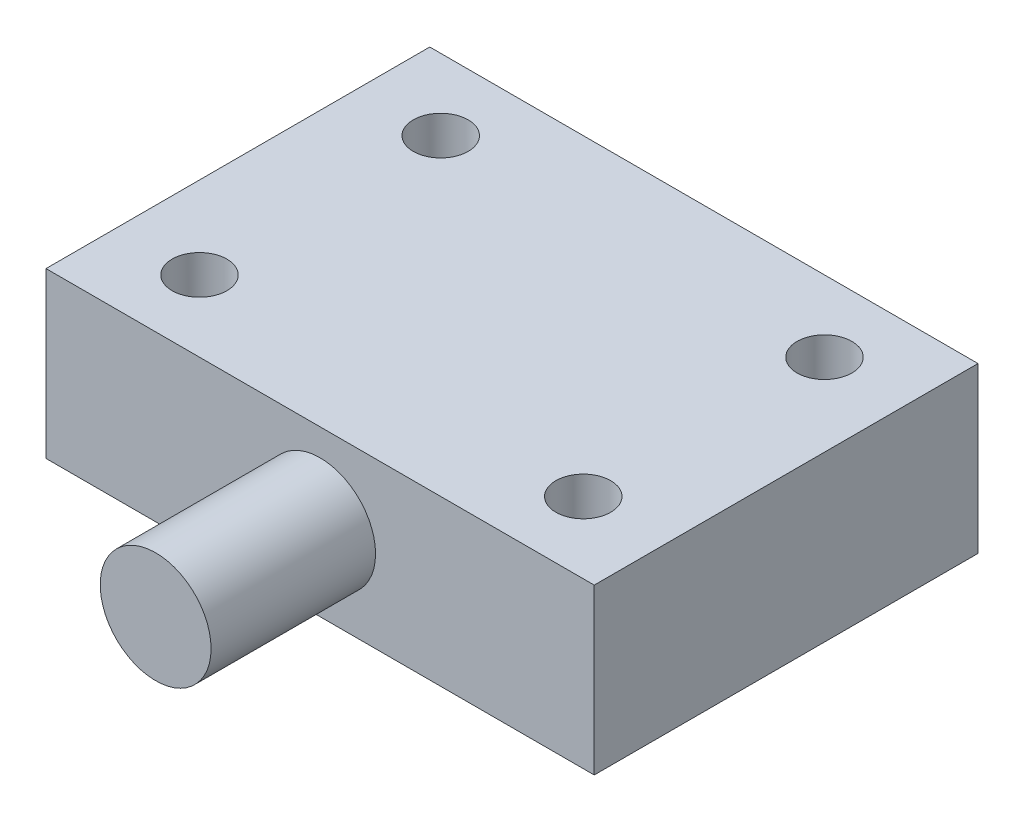
ISO-10303-21;
HEADER;
FILE_DESCRIPTION(('STEP AP214'),'2;1');
FILE_NAME('part.step','',(''),(''),'','','');
FILE_SCHEMA(('AUTOMOTIVE_DESIGN { 1 0 10303 214 1 1 1 1 }'));
ENDSEC;
DATA;
#1=APPLICATION_CONTEXT('core data for automotive mechanical design processes');
#2=APPLICATION_PROTOCOL_DEFINITION('international standard','automotive_design',2000,#1);
#3=PRODUCT_CONTEXT('',#1,'mechanical');
#4=PRODUCT('Part','Part','',(#3));
#5=PRODUCT_RELATED_PRODUCT_CATEGORY('part','',(#4));
#6=PRODUCT_DEFINITION_FORMATION('','',#4);
#7=PRODUCT_DEFINITION_CONTEXT('part definition',#1,'design');
#8=PRODUCT_DEFINITION('design','',#6,#7);
#9=PRODUCT_DEFINITION_SHAPE('','',#8);
#10=(LENGTH_UNIT() NAMED_UNIT(*) SI_UNIT(.MILLI.,.METRE.));
#11=(NAMED_UNIT(*) PLANE_ANGLE_UNIT() SI_UNIT($,.RADIAN.));
#12=(NAMED_UNIT(*) SI_UNIT($,.STERADIAN.) SOLID_ANGLE_UNIT());
#13=UNCERTAINTY_MEASURE_WITH_UNIT(LENGTH_MEASURE(1.E-05),#10,'distance_accuracy_value','');
#14=(GEOMETRIC_REPRESENTATION_CONTEXT(3) GLOBAL_UNCERTAINTY_ASSIGNED_CONTEXT((#13)) GLOBAL_UNIT_ASSIGNED_CONTEXT((#10,
#11,#12)) REPRESENTATION_CONTEXT('',''));
#15=CARTESIAN_POINT('',(0.,0.,0.));
#16=DIRECTION('',(0.,0.,1.));
#17=DIRECTION('',(1.,0.,0.));
#18=AXIS2_PLACEMENT_3D('',#15,#16,#17);
#19=CARTESIAN_POINT('',(25.,7.5,35.));
#20=DIRECTION('',(-1.,0.,0.));
#21=DIRECTION('',(0.,0.,1.));
#22=AXIS2_PLACEMENT_3D('',#19,#20,#21);
#23=PLANE('',#22);
#24=DIRECTION('',(0.,1.,0.));
#25=VECTOR('',#24,1.);
#26=CARTESIAN_POINT('',(25.,7.5,0.));
#27=LINE('',#26,#25);
#28=CARTESIAN_POINT('',(25.,-7.5,0.));
#29=VERTEX_POINT('',#28);
#30=CARTESIAN_POINT('',(25.,7.5,0.));
#31=VERTEX_POINT('',#30);
#32=EDGE_CURVE('E114',#29,#31,#27,.T.);
#33=ORIENTED_EDGE('',*,*,#32,.T.);
#34=DIRECTION('',(0.,0.,-1.));
#35=VECTOR('',#34,1.);
#36=CARTESIAN_POINT('',(25.,7.5,35.));
#37=LINE('',#36,#35);
#38=CARTESIAN_POINT('',(25.,7.5,35.));
#39=VERTEX_POINT('',#38);
#40=EDGE_CURVE('E51',#39,#31,#37,.T.);
#41=ORIENTED_EDGE('',*,*,#40,.F.);
#42=DIRECTION('',(0.,1.,0.));
#43=VECTOR('',#42,1.);
#44=CARTESIAN_POINT('',(25.,7.5,35.));
#45=LINE('',#44,#43);
#46=CARTESIAN_POINT('',(25.,-7.5,35.));
#47=VERTEX_POINT('',#46);
#48=EDGE_CURVE('E96',#47,#39,#45,.T.);
#49=ORIENTED_EDGE('',*,*,#48,.F.);
#50=DIRECTION('',(0.,0.,-1.));
#51=VECTOR('',#50,1.);
#52=CARTESIAN_POINT('',(25.,-7.5,35.));
#53=LINE('',#52,#51);
#54=EDGE_CURVE('E110',#47,#29,#53,.T.);
#55=ORIENTED_EDGE('',*,*,#54,.T.);
#56=EDGE_LOOP('',(#33,#41,#49,#55));
#57=FACE_BOUND('',#56,.T.);
#58=ADVANCED_FACE('F41',(#57),#23,.F.);
#59=CARTESIAN_POINT('',(-25.,7.5,35.));
#60=DIRECTION('',(0.,-1.,0.));
#61=DIRECTION('',(0.,0.,-1.));
#62=AXIS2_PLACEMENT_3D('',#59,#60,#61);
#63=PLANE('',#62);
#64=CARTESIAN_POINT('',(-17.5,7.5,6.5));
#65=DIRECTION('',(0.,1.,0.));
#66=DIRECTION('',(0.,0.,-1.));
#67=AXIS2_PLACEMENT_3D('',#64,#65,#66);
#68=CIRCLE('',#67,2.5);
#69=CARTESIAN_POINT('',(-17.5,7.5,4.));
#70=VERTEX_POINT('',#69);
#71=EDGE_CURVE('E250',#70,#70,#68,.T.);
#72=ORIENTED_EDGE('',*,*,#71,.F.);
#73=EDGE_LOOP('',(#72));
#74=FACE_BOUND('',#73,.T.);
#75=CARTESIAN_POINT('',(-17.5,7.5,28.5));
#76=DIRECTION('',(0.,1.,0.));
#77=DIRECTION('',(0.,0.,-1.));
#78=AXIS2_PLACEMENT_3D('',#75,#76,#77);
#79=CIRCLE('',#78,2.5);
#80=CARTESIAN_POINT('',(-17.5,7.5,26.));
#81=VERTEX_POINT('',#80);
#82=EDGE_CURVE('E243',#81,#81,#79,.T.);
#83=ORIENTED_EDGE('',*,*,#82,.F.);
#84=EDGE_LOOP('',(#83));
#85=FACE_BOUND('',#84,.T.);
#86=CARTESIAN_POINT('',(17.5,7.5,28.5));
#87=DIRECTION('',(0.,1.,0.));
#88=DIRECTION('',(0.,0.,1.));
#89=AXIS2_PLACEMENT_3D('',#86,#87,#88);
#90=CIRCLE('',#89,2.5);
#91=CARTESIAN_POINT('',(17.5,7.5,31.));
#92=VERTEX_POINT('',#91);
#93=EDGE_CURVE('E235',#92,#92,#90,.T.);
#94=ORIENTED_EDGE('',*,*,#93,.F.);
#95=EDGE_LOOP('',(#94));
#96=FACE_BOUND('',#95,.T.);
#97=CARTESIAN_POINT('',(17.5,7.5,6.5));
#98=DIRECTION('',(0.,1.,0.));
#99=DIRECTION('',(0.,0.,1.));
#100=AXIS2_PLACEMENT_3D('',#97,#98,#99);
#101=CIRCLE('',#100,2.5);
#102=CARTESIAN_POINT('',(17.5,7.5,9.));
#103=VERTEX_POINT('',#102);
#104=EDGE_CURVE('E135',#103,#103,#101,.T.);
#105=ORIENTED_EDGE('',*,*,#104,.F.);
#106=EDGE_LOOP('',(#105));
#107=FACE_BOUND('',#106,.T.);
#108=DIRECTION('',(-1.,0.,0.));
#109=VECTOR('',#108,1.);
#110=CARTESIAN_POINT('',(-25.,7.5,0.));
#111=LINE('',#110,#109);
#112=CARTESIAN_POINT('',(-25.,7.5,0.));
#113=VERTEX_POINT('',#112);
#114=EDGE_CURVE('E102',#31,#113,#111,.T.);
#115=ORIENTED_EDGE('',*,*,#114,.T.);
#116=DIRECTION('',(0.,0.,-1.));
#117=VECTOR('',#116,1.);
#118=CARTESIAN_POINT('',(-25.,7.5,35.));
#119=LINE('',#118,#117);
#120=CARTESIAN_POINT('',(-25.,7.5,35.));
#121=VERTEX_POINT('',#120);
#122=EDGE_CURVE('E100',#121,#113,#119,.T.);
#123=ORIENTED_EDGE('',*,*,#122,.F.);
#124=DIRECTION('',(-1.,0.,0.));
#125=VECTOR('',#124,1.);
#126=CARTESIAN_POINT('',(-25.,7.5,35.));
#127=LINE('',#126,#125);
#128=EDGE_CURVE('E91',#39,#121,#127,.T.);
#129=ORIENTED_EDGE('',*,*,#128,.F.);
#130=ORIENTED_EDGE('',*,*,#40,.T.);
#131=EDGE_LOOP('',(#115,#123,#129,#130));
#132=FACE_BOUND('',#131,.T.);
#133=ADVANCED_FACE('F101',(#74,#85,#96,#107,#132),#63,.F.);
#134=CARTESIAN_POINT('',(-25.,7.5,35.));
#135=DIRECTION('',(1.,0.,0.));
#136=DIRECTION('',(0.,0.,-1.));
#137=AXIS2_PLACEMENT_3D('',#134,#135,#136);
#138=PLANE('',#137);
#139=DIRECTION('',(0.,-1.,0.));
#140=VECTOR('',#139,1.);
#141=CARTESIAN_POINT('',(-25.,7.5,0.));
#142=LINE('',#141,#140);
#143=CARTESIAN_POINT('',(-25.,-7.5,0.));
#144=VERTEX_POINT('',#143);
#145=EDGE_CURVE('E77',#113,#144,#142,.T.);
#146=ORIENTED_EDGE('',*,*,#145,.T.);
#147=DIRECTION('',(0.,0.,-1.));
#148=VECTOR('',#147,1.);
#149=CARTESIAN_POINT('',(-25.,-7.5,35.));
#150=LINE('',#149,#148);
#151=CARTESIAN_POINT('',(-25.,-7.5,35.));
#152=VERTEX_POINT('',#151);
#153=EDGE_CURVE('E104',#152,#144,#150,.T.);
#154=ORIENTED_EDGE('',*,*,#153,.F.);
#155=DIRECTION('',(0.,-1.,0.));
#156=VECTOR('',#155,1.);
#157=CARTESIAN_POINT('',(-25.,7.5,35.));
#158=LINE('',#157,#156);
#159=EDGE_CURVE('E94',#121,#152,#158,.T.);
#160=ORIENTED_EDGE('',*,*,#159,.F.);
#161=ORIENTED_EDGE('',*,*,#122,.T.);
#162=EDGE_LOOP('',(#146,#154,#160,#161));
#163=FACE_BOUND('',#162,.T.);
#164=ADVANCED_FACE('F106',(#163),#138,.F.);
#165=CARTESIAN_POINT('',(-25.,-7.5,35.));
#166=DIRECTION('',(0.,1.,0.));
#167=DIRECTION('',(0.,0.,1.));
#168=AXIS2_PLACEMENT_3D('',#165,#166,#167);
#169=PLANE('',#168);
#170=CARTESIAN_POINT('',(-17.5,-7.5,6.5));
#171=DIRECTION('',(0.,1.,0.));
#172=DIRECTION('',(0.,0.,1.));
#173=AXIS2_PLACEMENT_3D('',#170,#171,#172);
#174=CIRCLE('',#173,2.5);
#175=CARTESIAN_POINT('',(-17.5,-7.5,8.99999999999999));
#176=VERTEX_POINT('',#175);
#177=EDGE_CURVE('E44',#176,#176,#174,.T.);
#178=ORIENTED_EDGE('',*,*,#177,.T.);
#179=EDGE_LOOP('',(#178));
#180=FACE_BOUND('',#179,.T.);
#181=CARTESIAN_POINT('',(-17.5,-7.5,28.5));
#182=DIRECTION('',(0.,1.,0.));
#183=DIRECTION('',(0.,0.,1.));
#184=AXIS2_PLACEMENT_3D('',#181,#182,#183);
#185=CIRCLE('',#184,2.5);
#186=CARTESIAN_POINT('',(-17.5,-7.5,31.));
#187=VERTEX_POINT('',#186);
#188=EDGE_CURVE('E138',#187,#187,#185,.T.);
#189=ORIENTED_EDGE('',*,*,#188,.T.);
#190=EDGE_LOOP('',(#189));
#191=FACE_BOUND('',#190,.T.);
#192=CARTESIAN_POINT('',(17.5,-7.5,28.5));
#193=DIRECTION('',(0.,1.,0.));
#194=DIRECTION('',(0.,0.,1.));
#195=AXIS2_PLACEMENT_3D('',#192,#193,#194);
#196=CIRCLE('',#195,2.5);
#197=CARTESIAN_POINT('',(17.5,-7.5,31.));
#198=VERTEX_POINT('',#197);
#199=EDGE_CURVE('E134',#198,#198,#196,.T.);
#200=ORIENTED_EDGE('',*,*,#199,.T.);
#201=EDGE_LOOP('',(#200));
#202=FACE_BOUND('',#201,.T.);
#203=CARTESIAN_POINT('',(17.5,-7.5,6.5));
#204=DIRECTION('',(0.,1.,0.));
#205=DIRECTION('',(0.,0.,1.));
#206=AXIS2_PLACEMENT_3D('',#203,#204,#205);
#207=CIRCLE('',#206,2.5);
#208=CARTESIAN_POINT('',(17.5,-7.5,9.));
#209=VERTEX_POINT('',#208);
#210=EDGE_CURVE('E130',#209,#209,#207,.T.);
#211=ORIENTED_EDGE('',*,*,#210,.T.);
#212=EDGE_LOOP('',(#211));
#213=FACE_BOUND('',#212,.T.);
#214=DIRECTION('',(1.,0.,0.));
#215=VECTOR('',#214,1.);
#216=CARTESIAN_POINT('',(-25.,-7.5,0.));
#217=LINE('',#216,#215);
#218=EDGE_CURVE('E83',#144,#29,#217,.T.);
#219=ORIENTED_EDGE('',*,*,#218,.T.);
#220=ORIENTED_EDGE('',*,*,#54,.F.);
#221=DIRECTION('',(1.,0.,0.));
#222=VECTOR('',#221,1.);
#223=CARTESIAN_POINT('',(-25.,-7.5,35.));
#224=LINE('',#223,#222);
#225=EDGE_CURVE('E60',#152,#47,#224,.T.);
#226=ORIENTED_EDGE('',*,*,#225,.F.);
#227=ORIENTED_EDGE('',*,*,#153,.T.);
#228=EDGE_LOOP('',(#219,#220,#226,#227));
#229=FACE_BOUND('',#228,.T.);
#230=ADVANCED_FACE('F147',(#180,#191,#202,#213,#229),#169,.F.);
#231=CARTESIAN_POINT('',(0.,0.,35.));
#232=DIRECTION('',(0.,0.,1.));
#233=DIRECTION('',(1.,0.,0.));
#234=AXIS2_PLACEMENT_3D('',#231,#232,#233);
#235=PLANE('',#234);
#236=CARTESIAN_POINT('',(0.,0.,35.));
#237=DIRECTION('',(0.,0.,1.));
#238=DIRECTION('',(1.,0.,0.));
#239=AXIS2_PLACEMENT_3D('',#236,#237,#238);
#240=CIRCLE('',#239,5.055);
#241=CARTESIAN_POINT('',(5.055,0.,35.));
#242=VERTEX_POINT('',#241);
#243=EDGE_CURVE('E11',#242,#242,#240,.T.);
#244=ORIENTED_EDGE('',*,*,#243,.F.);
#245=EDGE_LOOP('',(#244));
#246=FACE_BOUND('',#245,.T.);
#247=ORIENTED_EDGE('',*,*,#48,.T.);
#248=ORIENTED_EDGE('',*,*,#128,.T.);
#249=ORIENTED_EDGE('',*,*,#159,.T.);
#250=ORIENTED_EDGE('',*,*,#225,.T.);
#251=EDGE_LOOP('',(#247,#248,#249,#250));
#252=FACE_BOUND('',#251,.T.);
#253=ADVANCED_FACE('F92',(#246,#252),#235,.T.);
#254=CARTESIAN_POINT('',(0.,0.,0.));
#255=DIRECTION('',(0.,0.,1.));
#256=DIRECTION('',(1.,0.,0.));
#257=AXIS2_PLACEMENT_3D('',#254,#255,#256);
#258=PLANE('',#257);
#259=ORIENTED_EDGE('',*,*,#32,.F.);
#260=ORIENTED_EDGE('',*,*,#218,.F.);
#261=ORIENTED_EDGE('',*,*,#145,.F.);
#262=ORIENTED_EDGE('',*,*,#114,.F.);
#263=EDGE_LOOP('',(#259,#260,#261,#262));
#264=FACE_BOUND('',#263,.T.);
#265=ADVANCED_FACE('F175',(#264),#258,.F.);
#266=CARTESIAN_POINT('',(17.5,-22.5,6.5));
#267=DIRECTION('',(0.,1.,0.));
#268=DIRECTION('',(0.,0.,1.));
#269=AXIS2_PLACEMENT_3D('',#266,#267,#268);
#270=CYLINDRICAL_SURFACE('',#269,2.5);
#271=ORIENTED_EDGE('',*,*,#104,.T.);
#272=EDGE_LOOP('',(#271));
#273=FACE_BOUND('',#272,.T.);
#274=ORIENTED_EDGE('',*,*,#210,.F.);
#275=EDGE_LOOP('',(#274));
#276=FACE_BOUND('',#275,.T.);
#277=ADVANCED_FACE('F177',(#273,#276),#270,.F.);
#278=CARTESIAN_POINT('',(17.5,-22.5,28.5));
#279=DIRECTION('',(0.,1.,0.));
#280=DIRECTION('',(0.,0.,1.));
#281=AXIS2_PLACEMENT_3D('',#278,#279,#280);
#282=CYLINDRICAL_SURFACE('',#281,2.5);
#283=ORIENTED_EDGE('',*,*,#93,.T.);
#284=EDGE_LOOP('',(#283));
#285=FACE_BOUND('',#284,.T.);
#286=ORIENTED_EDGE('',*,*,#199,.F.);
#287=EDGE_LOOP('',(#286));
#288=FACE_BOUND('',#287,.T.);
#289=ADVANCED_FACE('F162',(#285,#288),#282,.F.);
#290=CARTESIAN_POINT('',(-17.5,-22.5,28.5));
#291=DIRECTION('',(0.,1.,0.));
#292=DIRECTION('',(0.,0.,1.));
#293=AXIS2_PLACEMENT_3D('',#290,#291,#292);
#294=CYLINDRICAL_SURFACE('',#293,2.5);
#295=ORIENTED_EDGE('',*,*,#82,.T.);
#296=EDGE_LOOP('',(#295));
#297=FACE_BOUND('',#296,.T.);
#298=ORIENTED_EDGE('',*,*,#188,.F.);
#299=EDGE_LOOP('',(#298));
#300=FACE_BOUND('',#299,.T.);
#301=ADVANCED_FACE('F152',(#297,#300),#294,.F.);
#302=CARTESIAN_POINT('',(-17.5,-22.5,6.5));
#303=DIRECTION('',(0.,1.,0.));
#304=DIRECTION('',(0.,0.,1.));
#305=AXIS2_PLACEMENT_3D('',#302,#303,#304);
#306=CYLINDRICAL_SURFACE('',#305,2.5);
#307=ORIENTED_EDGE('',*,*,#71,.T.);
#308=EDGE_LOOP('',(#307));
#309=FACE_BOUND('',#308,.T.);
#310=ORIENTED_EDGE('',*,*,#177,.F.);
#311=EDGE_LOOP('',(#310));
#312=FACE_BOUND('',#311,.T.);
#313=ADVANCED_FACE('F149',(#309,#312),#306,.F.);
#314=CARTESIAN_POINT('',(0.,0.,50.));
#315=DIRECTION('',(0.,0.,-1.));
#316=DIRECTION('',(-1.,0.,0.));
#317=AXIS2_PLACEMENT_3D('',#314,#315,#316);
#318=CYLINDRICAL_SURFACE('',#317,5.055);
#319=CARTESIAN_POINT('',(0.,0.,50.));
#320=DIRECTION('',(0.,0.,1.));
#321=DIRECTION('',(1.,0.,0.));
#322=AXIS2_PLACEMENT_3D('',#319,#320,#321);
#323=CIRCLE('',#322,5.055);
#324=CARTESIAN_POINT('',(5.055,0.,50.));
#325=VERTEX_POINT('',#324);
#326=EDGE_CURVE('E255',#325,#325,#323,.T.);
#327=ORIENTED_EDGE('',*,*,#326,.F.);
#328=EDGE_LOOP('',(#327));
#329=FACE_BOUND('',#328,.T.);
#330=ORIENTED_EDGE('',*,*,#243,.T.);
#331=EDGE_LOOP('',(#330));
#332=FACE_BOUND('',#331,.T.);
#333=ADVANCED_FACE('F151',(#329,#332),#318,.T.);
#334=CARTESIAN_POINT('',(0.,0.,50.));
#335=DIRECTION('',(0.,0.,1.));
#336=DIRECTION('',(1.,0.,0.));
#337=AXIS2_PLACEMENT_3D('',#334,#335,#336);
#338=PLANE('',#337);
#339=ORIENTED_EDGE('',*,*,#326,.T.);
#340=EDGE_LOOP('',(#339));
#341=FACE_BOUND('',#340,.T.);
#342=ADVANCED_FACE('F159',(#341),#338,.T.);
#343=CLOSED_SHELL('',(#58,#133,#164,#230,#253,#265,#277,#289,#301,#313,#333,#342));
#344=MANIFOLD_SOLID_BREP('B2',#343);
#345=ADVANCED_BREP_SHAPE_REPRESENTATION('',(#18,#344),#14);
#346=SHAPE_DEFINITION_REPRESENTATION(#9,#345);
ENDSEC;
END-ISO-10303-21;
